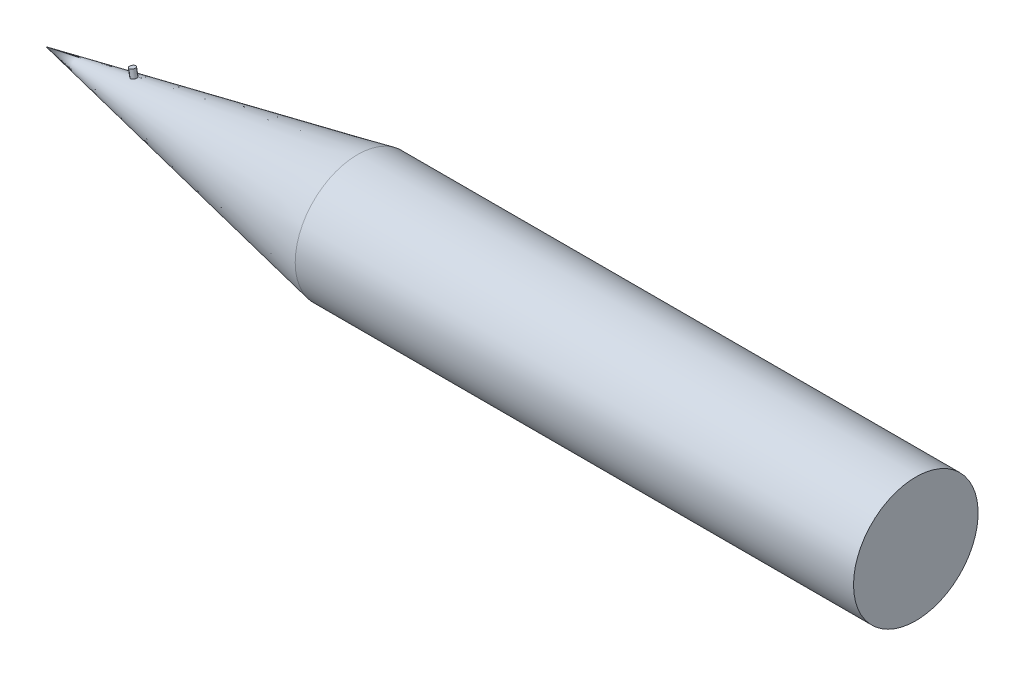
ISO-10303-21;
HEADER;
FILE_DESCRIPTION(('STEP AP214'),'2;1');
FILE_NAME('part.step','',(''),(''),'','','');
FILE_SCHEMA(('AUTOMOTIVE_DESIGN { 1 0 10303 214 1 1 1 1 }'));
ENDSEC;
DATA;
#1=APPLICATION_CONTEXT('core data for automotive mechanical design processes');
#2=APPLICATION_PROTOCOL_DEFINITION('international standard','automotive_design',2000,#1);
#3=PRODUCT_CONTEXT('',#1,'mechanical');
#4=PRODUCT('Part','Part','',(#3));
#5=PRODUCT_RELATED_PRODUCT_CATEGORY('part','',(#4));
#6=PRODUCT_DEFINITION_FORMATION('','',#4);
#7=PRODUCT_DEFINITION_CONTEXT('part definition',#1,'design');
#8=PRODUCT_DEFINITION('design','',#6,#7);
#9=PRODUCT_DEFINITION_SHAPE('','',#8);
#10=(LENGTH_UNIT() NAMED_UNIT(*) SI_UNIT(.MILLI.,.METRE.));
#11=(NAMED_UNIT(*) PLANE_ANGLE_UNIT() SI_UNIT($,.RADIAN.));
#12=(NAMED_UNIT(*) SI_UNIT($,.STERADIAN.) SOLID_ANGLE_UNIT());
#13=UNCERTAINTY_MEASURE_WITH_UNIT(LENGTH_MEASURE(1.E-05),#10,'distance_accuracy_value','');
#14=(GEOMETRIC_REPRESENTATION_CONTEXT(3) GLOBAL_UNCERTAINTY_ASSIGNED_CONTEXT((#13)) GLOBAL_UNIT_ASSIGNED_CONTEXT((#10,
#11,#12)) REPRESENTATION_CONTEXT('',''));
#15=CARTESIAN_POINT('',(0.,0.,0.));
#16=DIRECTION('',(0.,0.,1.));
#17=DIRECTION('',(1.,0.,0.));
#18=AXIS2_PLACEMENT_3D('',#15,#16,#17);
#19=CARTESIAN_POINT('',(0.,0.,0.));
#20=DIRECTION('',(-1.,0.,0.));
#21=DIRECTION('',(0.,0.,1.));
#22=AXIS2_PLACEMENT_3D('',#19,#20,#21);
#23=CYLINDRICAL_SURFACE('',#22,3.17513893808549);
#24=CARTESIAN_POINT('',(44.33,0.,0.));
#25=DIRECTION('',(-1.,0.,0.));
#26=DIRECTION('',(0.,0.,1.));
#27=AXIS2_PLACEMENT_3D('',#24,#25,#26);
#28=CIRCLE('',#27,3.17513893808549);
#29=CARTESIAN_POINT('',(44.33,0.,3.17513893808549));
#30=VERTEX_POINT('',#29);
#31=EDGE_CURVE('E58',#30,#30,#28,.T.);
#32=ORIENTED_EDGE('',*,*,#31,.T.);
#33=EDGE_LOOP('',(#32));
#34=FACE_BOUND('',#33,.T.);
#35=CARTESIAN_POINT('',(15.8755973973849,0.,0.));
#36=DIRECTION('',(-1.,0.,0.));
#37=DIRECTION('',(0.,0.,1.));
#38=AXIS2_PLACEMENT_3D('',#35,#36,#37);
#39=CIRCLE('',#38,3.17513893808549);
#40=CARTESIAN_POINT('',(15.8755973973849,0.,3.17513893808549));
#41=VERTEX_POINT('',#40);
#42=EDGE_CURVE('E12',#41,#41,#39,.T.);
#43=ORIENTED_EDGE('',*,*,#42,.F.);
#44=EDGE_LOOP('',(#43));
#45=FACE_BOUND('',#44,.T.);
#46=ADVANCED_FACE('F51',(#34,#45),#23,.T.);
#47=CARTESIAN_POINT('',(0.,0.,0.));
#48=DIRECTION('',(1.,0.,0.));
#49=DIRECTION('',(0.,0.,-1.));
#50=AXIS2_PLACEMENT_3D('',#47,#48,#49);
#51=CONICAL_SURFACE('',#50,0.,0.197396738400559);
#52=ORIENTED_EDGE('',*,*,#42,.T.);
#53=EDGE_LOOP('',(#52));
#54=FACE_BOUND('',#53,.T.);
#55=CARTESIAN_POINT('',(0.,0.,0.));
#56=VERTEX_POINT('',#55);
#57=VERTEX_LOOP('',#56);
#58=FACE_BOUND('',#57,.T.);
#59=ADVANCED_FACE('F61',(#54,#58),#51,.T.);
#60=CARTESIAN_POINT('',(44.33,0.,0.));
#61=DIRECTION('',(1.,0.,0.));
#62=DIRECTION('',(0.,0.,-1.));
#63=AXIS2_PLACEMENT_3D('',#60,#61,#62);
#64=PLANE('',#63);
#65=ORIENTED_EDGE('',*,*,#31,.F.);
#66=EDGE_LOOP('',(#65));
#67=FACE_BOUND('',#66,.T.);
#68=ADVANCED_FACE('F63',(#67),#64,.T.);
#69=CLOSED_SHELL('',(#46,#59,#68));
#70=MANIFOLD_SOLID_BREP('B2',#69);
#71=CARTESIAN_POINT('',(4.40280570328775,1.29868623581561,0.));
#72=DIRECTION('',(0.196117290802068,-0.980580444557435,0.));
#73=DIRECTION('',(0.980580444557435,0.196117290802068,0.));
#74=AXIS2_PLACEMENT_3D('',#71,#72,#73);
#75=CYLINDRICAL_SURFACE('',#74,0.15);
#76=CARTESIAN_POINT('',(4.40280570328775,1.29868623581561,0.));
#77=DIRECTION('',(-0.196117290802068,0.980580444557435,0.));
#78=DIRECTION('',(-0.980580444557435,-0.196117290802068,0.));
#79=AXIS2_PLACEMENT_3D('',#76,#77,#78);
#80=CIRCLE('',#79,0.15);
#81=CARTESIAN_POINT('',(4.25571863660413,1.26926864219529,0.));
#82=VERTEX_POINT('',#81);
#83=EDGE_CURVE('E50',#82,#82,#80,.T.);
#84=ORIENTED_EDGE('',*,*,#83,.F.);
#85=EDGE_LOOP('',(#84));
#86=FACE_BOUND('',#85,.T.);
#87=CARTESIAN_POINT('',(4.48321379251659,0.896648253547056,0.));
#88=DIRECTION('',(-0.196117290802068,0.980580444557435,0.));
#89=DIRECTION('',(-0.980580444557435,-0.196117290802068,0.));
#90=AXIS2_PLACEMENT_3D('',#87,#88,#89);
#91=CIRCLE('',#90,0.15);
#92=CARTESIAN_POINT('',(4.33612672583298,0.867230659926746,0.));
#93=VERTEX_POINT('',#92);
#94=EDGE_CURVE('E105',#93,#93,#91,.T.);
#95=ORIENTED_EDGE('',*,*,#94,.T.);
#96=EDGE_LOOP('',(#95));
#97=FACE_BOUND('',#96,.T.);
#98=ADVANCED_FACE('F102',(#86,#97),#75,.T.);
#99=CARTESIAN_POINT('',(4.40280570328775,1.29868623581561,0.));
#100=DIRECTION('',(-0.196117290802068,0.980580444557435,0.));
#101=DIRECTION('',(-0.980580444557435,-0.196117290802068,0.));
#102=AXIS2_PLACEMENT_3D('',#99,#100,#101);
#103=PLANE('',#102);
#104=ORIENTED_EDGE('',*,*,#83,.T.);
#105=EDGE_LOOP('',(#104));
#106=FACE_BOUND('',#105,.T.);
#107=ADVANCED_FACE('F117',(#106),#103,.T.);
#108=CARTESIAN_POINT('',(4.48321379251659,0.896648253547056,0.));
#109=DIRECTION('',(-0.196117290802068,0.980580444557435,0.));
#110=DIRECTION('',(-0.980580444557435,-0.196117290802068,0.));
#111=AXIS2_PLACEMENT_3D('',#108,#109,#110);
#112=PLANE('',#111);
#113=ORIENTED_EDGE('',*,*,#94,.F.);
#114=EDGE_LOOP('',(#113));
#115=FACE_BOUND('',#114,.T.);
#116=ADVANCED_FACE('F115',(#115),#112,.F.);
#117=CLOSED_SHELL('',(#98,#107,#116));
#118=MANIFOLD_SOLID_BREP('B6',#117);
#119=ADVANCED_BREP_SHAPE_REPRESENTATION('',(#18,#70,#118),#14);
#120=SHAPE_DEFINITION_REPRESENTATION(#9,#119);
ENDSEC;
END-ISO-10303-21;
